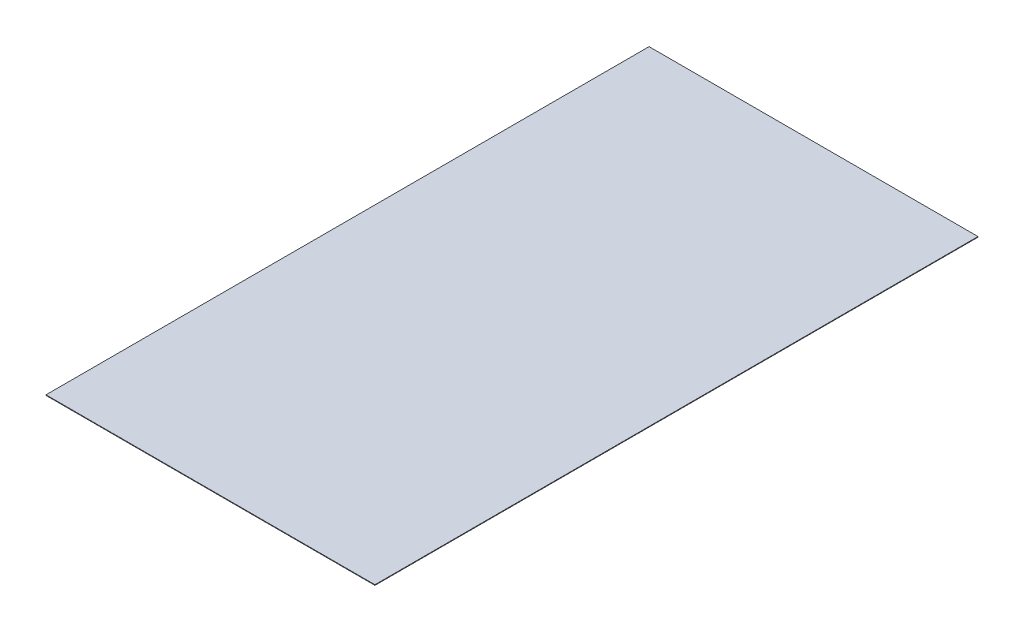
ISO-10303-21;
HEADER;
FILE_DESCRIPTION(('STEP AP214'),'2;1');
FILE_NAME('part.step','',(''),(''),'','','');
FILE_SCHEMA(('AUTOMOTIVE_DESIGN { 1 0 10303 214 1 1 1 1 }'));
ENDSEC;
DATA;
#1=APPLICATION_CONTEXT('core data for automotive mechanical design processes');
#2=APPLICATION_PROTOCOL_DEFINITION('international standard','automotive_design',2000,#1);
#3=PRODUCT_CONTEXT('',#1,'mechanical');
#4=PRODUCT('Part','Part','',(#3));
#5=PRODUCT_RELATED_PRODUCT_CATEGORY('part','',(#4));
#6=PRODUCT_DEFINITION_FORMATION('','',#4);
#7=PRODUCT_DEFINITION_CONTEXT('part definition',#1,'design');
#8=PRODUCT_DEFINITION('design','',#6,#7);
#9=PRODUCT_DEFINITION_SHAPE('','',#8);
#10=(LENGTH_UNIT() NAMED_UNIT(*) SI_UNIT(.MILLI.,.METRE.));
#11=(NAMED_UNIT(*) PLANE_ANGLE_UNIT() SI_UNIT($,.RADIAN.));
#12=(NAMED_UNIT(*) SI_UNIT($,.STERADIAN.) SOLID_ANGLE_UNIT());
#13=UNCERTAINTY_MEASURE_WITH_UNIT(LENGTH_MEASURE(1.E-05),#10,'distance_accuracy_value','');
#14=(GEOMETRIC_REPRESENTATION_CONTEXT(3) GLOBAL_UNCERTAINTY_ASSIGNED_CONTEXT((#13)) GLOBAL_UNIT_ASSIGNED_CONTEXT((#10,
#11,#12)) REPRESENTATION_CONTEXT('',''));
#15=CARTESIAN_POINT('',(0.,0.,0.));
#16=DIRECTION('',(0.,0.,1.));
#17=DIRECTION('',(1.,0.,0.));
#18=AXIS2_PLACEMENT_3D('',#15,#16,#17);
#19=CARTESIAN_POINT('',(1828.8,6.35,-3352.8));
#20=DIRECTION('',(-1.,0.,0.));
#21=DIRECTION('',(0.,0.,1.));
#22=AXIS2_PLACEMENT_3D('',#19,#20,#21);
#23=PLANE('',#22);
#24=DIRECTION('',(0.,0.,-1.));
#25=VECTOR('',#24,1.);
#26=CARTESIAN_POINT('',(1828.8,0.,-3352.8));
#27=LINE('',#26,#25);
#28=CARTESIAN_POINT('',(1828.8,0.,3352.8));
#29=VERTEX_POINT('',#28);
#30=CARTESIAN_POINT('',(1828.8,0.,-3352.8));
#31=VERTEX_POINT('',#30);
#32=EDGE_CURVE('E120',#29,#31,#27,.T.);
#33=ORIENTED_EDGE('',*,*,#32,.T.);
#34=DIRECTION('',(0.,-1.,0.));
#35=VECTOR('',#34,1.);
#36=CARTESIAN_POINT('',(1828.8,6.35,-3352.8));
#37=LINE('',#36,#35);
#38=CARTESIAN_POINT('',(1828.8,6.35,-3352.8));
#39=VERTEX_POINT('',#38);
#40=EDGE_CURVE('E11',#39,#31,#37,.T.);
#41=ORIENTED_EDGE('',*,*,#40,.F.);
#42=DIRECTION('',(0.,0.,-1.));
#43=VECTOR('',#42,1.);
#44=CARTESIAN_POINT('',(1828.8,6.35,-3352.8));
#45=LINE('',#44,#43);
#46=CARTESIAN_POINT('',(1828.8,6.35,3352.8));
#47=VERTEX_POINT('',#46);
#48=EDGE_CURVE('E101',#47,#39,#45,.T.);
#49=ORIENTED_EDGE('',*,*,#48,.F.);
#50=DIRECTION('',(0.,-1.,0.));
#51=VECTOR('',#50,1.);
#52=CARTESIAN_POINT('',(1828.8,6.35,3352.8));
#53=LINE('',#52,#51);
#54=EDGE_CURVE('E114',#47,#29,#53,.T.);
#55=ORIENTED_EDGE('',*,*,#54,.T.);
#56=EDGE_LOOP('',(#33,#41,#49,#55));
#57=FACE_BOUND('',#56,.T.);
#58=ADVANCED_FACE('F47',(#57),#23,.F.);
#59=CARTESIAN_POINT('',(-1828.8,6.35,-3352.8));
#60=DIRECTION('',(0.,0.,1.));
#61=DIRECTION('',(1.,0.,0.));
#62=AXIS2_PLACEMENT_3D('',#59,#60,#61);
#63=PLANE('',#62);
#64=DIRECTION('',(-1.,0.,0.));
#65=VECTOR('',#64,1.);
#66=CARTESIAN_POINT('',(-1828.8,0.,-3352.8));
#67=LINE('',#66,#65);
#68=CARTESIAN_POINT('',(-1828.8,0.,-3352.8));
#69=VERTEX_POINT('',#68);
#70=EDGE_CURVE('E106',#31,#69,#67,.T.);
#71=ORIENTED_EDGE('',*,*,#70,.T.);
#72=DIRECTION('',(0.,-1.,0.));
#73=VECTOR('',#72,1.);
#74=CARTESIAN_POINT('',(-1828.8,6.35,-3352.8));
#75=LINE('',#74,#73);
#76=CARTESIAN_POINT('',(-1828.8,6.35,-3352.8));
#77=VERTEX_POINT('',#76);
#78=EDGE_CURVE('E59',#77,#69,#75,.T.);
#79=ORIENTED_EDGE('',*,*,#78,.F.);
#80=DIRECTION('',(-1.,0.,0.));
#81=VECTOR('',#80,1.);
#82=CARTESIAN_POINT('',(-1828.8,6.35,-3352.8));
#83=LINE('',#82,#81);
#84=EDGE_CURVE('E96',#39,#77,#83,.T.);
#85=ORIENTED_EDGE('',*,*,#84,.F.);
#86=ORIENTED_EDGE('',*,*,#40,.T.);
#87=EDGE_LOOP('',(#71,#79,#85,#86));
#88=FACE_BOUND('',#87,.T.);
#89=ADVANCED_FACE('F104',(#88),#63,.F.);
#90=CARTESIAN_POINT('',(-1828.8,6.35,-3352.8));
#91=DIRECTION('',(1.,0.,0.));
#92=DIRECTION('',(0.,0.,-1.));
#93=AXIS2_PLACEMENT_3D('',#90,#91,#92);
#94=PLANE('',#93);
#95=DIRECTION('',(0.,0.,1.));
#96=VECTOR('',#95,1.);
#97=CARTESIAN_POINT('',(-1828.8,0.,-3352.8));
#98=LINE('',#97,#96);
#99=CARTESIAN_POINT('',(-1828.8,0.,3352.8));
#100=VERTEX_POINT('',#99);
#101=EDGE_CURVE('E83',#69,#100,#98,.T.);
#102=ORIENTED_EDGE('',*,*,#101,.T.);
#103=DIRECTION('',(0.,-1.,0.));
#104=VECTOR('',#103,1.);
#105=CARTESIAN_POINT('',(-1828.8,6.35,3352.8));
#106=LINE('',#105,#104);
#107=CARTESIAN_POINT('',(-1828.8,6.35,3352.8));
#108=VERTEX_POINT('',#107);
#109=EDGE_CURVE('E107',#108,#100,#106,.T.);
#110=ORIENTED_EDGE('',*,*,#109,.F.);
#111=DIRECTION('',(0.,0.,1.));
#112=VECTOR('',#111,1.);
#113=CARTESIAN_POINT('',(-1828.8,6.35,-3352.8));
#114=LINE('',#113,#112);
#115=EDGE_CURVE('E97',#77,#108,#114,.T.);
#116=ORIENTED_EDGE('',*,*,#115,.F.);
#117=ORIENTED_EDGE('',*,*,#78,.T.);
#118=EDGE_LOOP('',(#102,#110,#116,#117));
#119=FACE_BOUND('',#118,.T.);
#120=ADVANCED_FACE('F108',(#119),#94,.F.);
#121=CARTESIAN_POINT('',(-1828.8,6.35,3352.8));
#122=DIRECTION('',(0.,0.,-1.));
#123=DIRECTION('',(-1.,0.,0.));
#124=AXIS2_PLACEMENT_3D('',#121,#122,#123);
#125=PLANE('',#124);
#126=DIRECTION('',(1.,0.,0.));
#127=VECTOR('',#126,1.);
#128=CARTESIAN_POINT('',(-1828.8,0.,3352.8));
#129=LINE('',#128,#127);
#130=EDGE_CURVE('E90',#100,#29,#129,.T.);
#131=ORIENTED_EDGE('',*,*,#130,.T.);
#132=ORIENTED_EDGE('',*,*,#54,.F.);
#133=DIRECTION('',(1.,0.,0.));
#134=VECTOR('',#133,1.);
#135=CARTESIAN_POINT('',(-1828.8,6.35,3352.8));
#136=LINE('',#135,#134);
#137=EDGE_CURVE('E66',#108,#47,#136,.T.);
#138=ORIENTED_EDGE('',*,*,#137,.F.);
#139=ORIENTED_EDGE('',*,*,#109,.T.);
#140=EDGE_LOOP('',(#131,#132,#138,#139));
#141=FACE_BOUND('',#140,.T.);
#142=ADVANCED_FACE('F128',(#141),#125,.F.);
#143=CARTESIAN_POINT('',(0.,6.35,0.));
#144=DIRECTION('',(0.,1.,0.));
#145=DIRECTION('',(0.,0.,1.));
#146=AXIS2_PLACEMENT_3D('',#143,#144,#145);
#147=PLANE('',#146);
#148=ORIENTED_EDGE('',*,*,#48,.T.);
#149=ORIENTED_EDGE('',*,*,#84,.T.);
#150=ORIENTED_EDGE('',*,*,#115,.T.);
#151=ORIENTED_EDGE('',*,*,#137,.T.);
#152=EDGE_LOOP('',(#148,#149,#150,#151));
#153=FACE_BOUND('',#152,.T.);
#154=ADVANCED_FACE('F100',(#153),#147,.T.);
#155=CARTESIAN_POINT('',(0.,0.,0.));
#156=DIRECTION('',(0.,1.,0.));
#157=DIRECTION('',(0.,0.,1.));
#158=AXIS2_PLACEMENT_3D('',#155,#156,#157);
#159=PLANE('',#158);
#160=ORIENTED_EDGE('',*,*,#32,.F.);
#161=ORIENTED_EDGE('',*,*,#130,.F.);
#162=ORIENTED_EDGE('',*,*,#101,.F.);
#163=ORIENTED_EDGE('',*,*,#70,.F.);
#164=EDGE_LOOP('',(#160,#161,#162,#163));
#165=FACE_BOUND('',#164,.T.);
#166=ADVANCED_FACE('F134',(#165),#159,.F.);
#167=CLOSED_SHELL('',(#58,#89,#120,#142,#154,#166));
#168=MANIFOLD_SOLID_BREP('B2',#167);
#169=ADVANCED_BREP_SHAPE_REPRESENTATION('',(#18,#168),#14);
#170=SHAPE_DEFINITION_REPRESENTATION(#9,#169);
ENDSEC;
END-ISO-10303-21;
